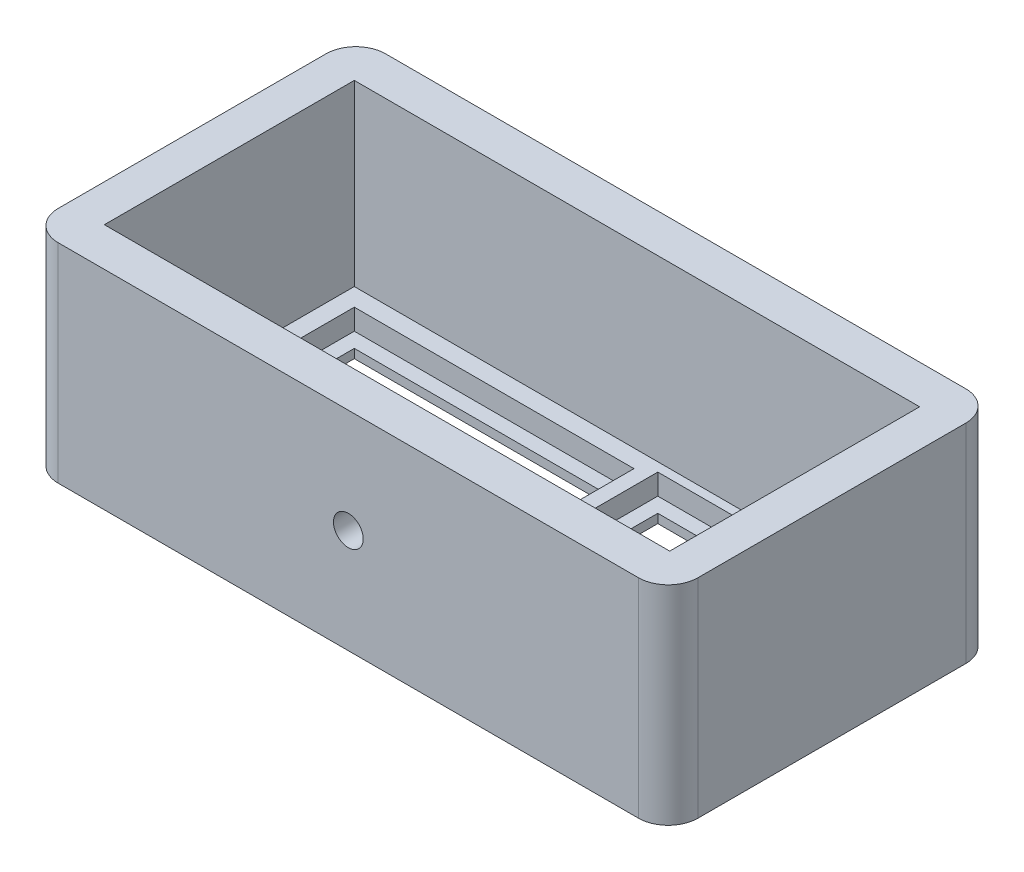
ISO-10303-21;
HEADER;
FILE_DESCRIPTION(('STEP AP214'),'2;1');
FILE_NAME('part.step','',(''),(''),'','','');
FILE_SCHEMA(('AUTOMOTIVE_DESIGN { 1 0 10303 214 1 1 1 1 }'));
ENDSEC;
DATA;
#1=APPLICATION_CONTEXT('core data for automotive mechanical design processes');
#2=APPLICATION_PROTOCOL_DEFINITION('international standard','automotive_design',2000,#1);
#3=PRODUCT_CONTEXT('',#1,'mechanical');
#4=PRODUCT('Part','Part','',(#3));
#5=PRODUCT_RELATED_PRODUCT_CATEGORY('part','',(#4));
#6=PRODUCT_DEFINITION_FORMATION('','',#4);
#7=PRODUCT_DEFINITION_CONTEXT('part definition',#1,'design');
#8=PRODUCT_DEFINITION('design','',#6,#7);
#9=PRODUCT_DEFINITION_SHAPE('','',#8);
#10=(LENGTH_UNIT() NAMED_UNIT(*) SI_UNIT(.MILLI.,.METRE.));
#11=(NAMED_UNIT(*) PLANE_ANGLE_UNIT() SI_UNIT($,.RADIAN.));
#12=(NAMED_UNIT(*) SI_UNIT($,.STERADIAN.) SOLID_ANGLE_UNIT());
#13=UNCERTAINTY_MEASURE_WITH_UNIT(LENGTH_MEASURE(1.E-05),#10,'distance_accuracy_value','');
#14=(GEOMETRIC_REPRESENTATION_CONTEXT(3) GLOBAL_UNCERTAINTY_ASSIGNED_CONTEXT((#13)) GLOBAL_UNIT_ASSIGNED_CONTEXT((#10,
#11,#12)) REPRESENTATION_CONTEXT('',''));
#15=CARTESIAN_POINT('',(0.,0.,0.));
#16=DIRECTION('',(0.,0.,1.));
#17=DIRECTION('',(1.,0.,0.));
#18=AXIS2_PLACEMENT_3D('',#15,#16,#17);
#19=CARTESIAN_POINT('',(-17.8,0.6,-7.2));
#20=DIRECTION('',(-1.,0.,0.));
#21=DIRECTION('',(0.,0.,1.));
#22=AXIS2_PLACEMENT_3D('',#19,#20,#21);
#23=PLANE('',#22);
#24=DIRECTION('',(0.,0.,1.));
#25=VECTOR('',#24,1.);
#26=CARTESIAN_POINT('',(-17.8,2.,-7.2));
#27=LINE('',#26,#25);
#28=CARTESIAN_POINT('',(-17.8,2.,-7.2));
#29=VERTEX_POINT('',#28);
#30=CARTESIAN_POINT('',(-17.8,2.,8.));
#31=VERTEX_POINT('',#30);
#32=EDGE_CURVE('E378',#29,#31,#27,.T.);
#33=ORIENTED_EDGE('',*,*,#32,.T.);
#34=DIRECTION('',(0.,1.,0.));
#35=VECTOR('',#34,1.);
#36=CARTESIAN_POINT('',(-17.8,0.6,8.));
#37=LINE('',#36,#35);
#38=CARTESIAN_POINT('',(-17.8,0.6,8.));
#39=VERTEX_POINT('',#38);
#40=EDGE_CURVE('E377',#39,#31,#37,.T.);
#41=ORIENTED_EDGE('',*,*,#40,.F.);
#42=DIRECTION('',(0.,0.,1.));
#43=VECTOR('',#42,1.);
#44=CARTESIAN_POINT('',(-17.8,0.6,-7.2));
#45=LINE('',#44,#43);
#46=CARTESIAN_POINT('',(-17.8,0.6,-7.2));
#47=VERTEX_POINT('',#46);
#48=EDGE_CURVE('E364',#47,#39,#45,.T.);
#49=ORIENTED_EDGE('',*,*,#48,.F.);
#50=DIRECTION('',(0.,1.,0.));
#51=VECTOR('',#50,1.);
#52=CARTESIAN_POINT('',(-17.8,0.6,-7.2));
#53=LINE('',#52,#51);
#54=EDGE_CURVE('E386',#47,#29,#53,.T.);
#55=ORIENTED_EDGE('',*,*,#54,.T.);
#56=EDGE_LOOP('',(#33,#41,#49,#55));
#57=FACE_BOUND('',#56,.T.);
#58=ADVANCED_FACE('F47',(#57),#23,.F.);
#59=CARTESIAN_POINT('',(-17.8,0.6,8.));
#60=DIRECTION('',(0.,0.,1.));
#61=DIRECTION('',(1.,0.,0.));
#62=AXIS2_PLACEMENT_3D('',#59,#60,#61);
#63=PLANE('',#62);
#64=DIRECTION('',(-1.,0.,0.));
#65=VECTOR('',#64,1.);
#66=CARTESIAN_POINT('',(-17.8,2.,8.));
#67=LINE('',#66,#65);
#68=CARTESIAN_POINT('',(17.8,2.,7.99999999999999));
#69=VERTEX_POINT('',#68);
#70=CARTESIAN_POINT('',(2.00000000000001,2.,8.));
#71=VERTEX_POINT('',#70);
#72=EDGE_CURVE('E253',#69,#71,#67,.T.);
#73=ORIENTED_EDGE('',*,*,#72,.F.);
#74=DIRECTION('',(0.,1.,0.));
#75=VECTOR('',#74,1.);
#76=CARTESIAN_POINT('',(17.8,0.6,8.));
#77=LINE('',#76,#75);
#78=CARTESIAN_POINT('',(17.8,0.6,8.));
#79=VERTEX_POINT('',#78);
#80=EDGE_CURVE('E400',#79,#69,#77,.T.);
#81=ORIENTED_EDGE('',*,*,#80,.F.);
#82=DIRECTION('',(1.,0.,0.));
#83=VECTOR('',#82,1.);
#84=CARTESIAN_POINT('',(2.00000000000001,0.6,8.));
#85=LINE('',#84,#83);
#86=CARTESIAN_POINT('',(2.00000000000001,0.6,8.));
#87=VERTEX_POINT('',#86);
#88=EDGE_CURVE('E420',#87,#79,#85,.T.);
#89=ORIENTED_EDGE('',*,*,#88,.F.);
#90=DIRECTION('',(0.,1.,0.));
#91=VECTOR('',#90,1.);
#92=CARTESIAN_POINT('',(2.00000000000001,0.6,8.));
#93=LINE('',#92,#91);
#94=EDGE_CURVE('E396',#87,#71,#93,.T.);
#95=ORIENTED_EDGE('',*,*,#94,.T.);
#96=EDGE_LOOP('',(#73,#81,#89,#95));
#97=FACE_BOUND('',#96,.T.);
#98=ADVANCED_FACE('F500',(#97),#63,.F.);
#99=CARTESIAN_POINT('',(1.00000000000001,2.,8.));
#100=VERTEX_POINT('',#99);
#101=EDGE_CURVE('E276',#100,#31,#67,.T.);
#102=ORIENTED_EDGE('',*,*,#101,.F.);
#103=DIRECTION('',(0.,1.,0.));
#104=VECTOR('',#103,1.);
#105=CARTESIAN_POINT('',(1.00000000000001,0.6,8.));
#106=LINE('',#105,#104);
#107=CARTESIAN_POINT('',(1.00000000000001,0.6,8.));
#108=VERTEX_POINT('',#107);
#109=EDGE_CURVE('E391',#108,#100,#106,.T.);
#110=ORIENTED_EDGE('',*,*,#109,.F.);
#111=DIRECTION('',(1.,0.,0.));
#112=VECTOR('',#111,1.);
#113=CARTESIAN_POINT('',(-17.8,0.6,8.));
#114=LINE('',#113,#112);
#115=EDGE_CURVE('E367',#39,#108,#114,.T.);
#116=ORIENTED_EDGE('',*,*,#115,.F.);
#117=ORIENTED_EDGE('',*,*,#40,.T.);
#118=EDGE_LOOP('',(#102,#110,#116,#117));
#119=FACE_BOUND('',#118,.T.);
#120=ADVANCED_FACE('F507',(#119),#63,.F.);
#121=CARTESIAN_POINT('',(0.,14.,0.));
#122=DIRECTION('',(0.,1.,0.));
#123=DIRECTION('',(0.,0.,1.));
#124=AXIS2_PLACEMENT_3D('',#121,#122,#123);
#125=PLANE('',#124);
#126=DIRECTION('',(0.,0.,-1.));
#127=VECTOR('',#126,1.);
#128=CARTESIAN_POINT('',(21.5,14.,0.));
#129=LINE('',#128,#127);
#130=CARTESIAN_POINT('',(21.5,14.,8.99999999999999));
#131=VERTEX_POINT('',#130);
#132=CARTESIAN_POINT('',(21.5,14.,-9.00000000000001));
#133=VERTEX_POINT('',#132);
#134=EDGE_CURVE('E277',#131,#133,#129,.T.);
#135=ORIENTED_EDGE('',*,*,#134,.T.);
#136=CARTESIAN_POINT('',(19.5,14.,-9.00000000000001));
#137=DIRECTION('',(0.,1.,0.));
#138=DIRECTION('',(0.,0.,1.));
#139=AXIS2_PLACEMENT_3D('',#136,#137,#138);
#140=CIRCLE('',#139,2.);
#141=CARTESIAN_POINT('',(19.5,14.,-11.));
#142=VERTEX_POINT('',#141);
#143=EDGE_CURVE('E280',#133,#142,#140,.T.);
#144=ORIENTED_EDGE('',*,*,#143,.T.);
#145=DIRECTION('',(-1.,0.,0.));
#146=VECTOR('',#145,1.);
#147=CARTESIAN_POINT('',(0.,14.,-11.));
#148=LINE('',#147,#146);
#149=CARTESIAN_POINT('',(-19.5,14.,-11.));
#150=VERTEX_POINT('',#149);
#151=EDGE_CURVE('E283',#142,#150,#148,.T.);
#152=ORIENTED_EDGE('',*,*,#151,.T.);
#153=CARTESIAN_POINT('',(-19.5,14.,-9.));
#154=DIRECTION('',(0.,1.,0.));
#155=DIRECTION('',(0.,0.,1.));
#156=AXIS2_PLACEMENT_3D('',#153,#154,#155);
#157=CIRCLE('',#156,2.);
#158=CARTESIAN_POINT('',(-21.5,14.,-9.));
#159=VERTEX_POINT('',#158);
#160=EDGE_CURVE('E286',#150,#159,#157,.T.);
#161=ORIENTED_EDGE('',*,*,#160,.T.);
#162=DIRECTION('',(0.,0.,1.));
#163=VECTOR('',#162,1.);
#164=CARTESIAN_POINT('',(-21.5,14.,0.));
#165=LINE('',#164,#163);
#166=CARTESIAN_POINT('',(-21.5,14.,9.));
#167=VERTEX_POINT('',#166);
#168=EDGE_CURVE('E289',#159,#167,#165,.T.);
#169=ORIENTED_EDGE('',*,*,#168,.T.);
#170=CARTESIAN_POINT('',(-19.5,14.,9.));
#171=DIRECTION('',(0.,1.,0.));
#172=DIRECTION('',(0.,0.,1.));
#173=AXIS2_PLACEMENT_3D('',#170,#171,#172);
#174=CIRCLE('',#173,2.);
#175=CARTESIAN_POINT('',(-19.5,14.,11.));
#176=VERTEX_POINT('',#175);
#177=EDGE_CURVE('E292',#167,#176,#174,.T.);
#178=ORIENTED_EDGE('',*,*,#177,.T.);
#179=DIRECTION('',(1.,0.,0.));
#180=VECTOR('',#179,1.);
#181=CARTESIAN_POINT('',(0.,14.,11.));
#182=LINE('',#181,#180);
#183=CARTESIAN_POINT('',(19.5,14.,11.));
#184=VERTEX_POINT('',#183);
#185=EDGE_CURVE('E295',#176,#184,#182,.T.);
#186=ORIENTED_EDGE('',*,*,#185,.T.);
#187=CARTESIAN_POINT('',(19.5,14.,8.99999999999999));
#188=DIRECTION('',(0.,1.,0.));
#189=DIRECTION('',(0.,0.,1.));
#190=AXIS2_PLACEMENT_3D('',#187,#188,#189);
#191=CIRCLE('',#190,2.);
#192=EDGE_CURVE('E298',#184,#131,#191,.T.);
#193=ORIENTED_EDGE('',*,*,#192,.T.);
#194=EDGE_LOOP('',(#135,#144,#152,#161,#169,#178,#186,#193));
#195=FACE_BOUND('',#194,.T.);
#196=DIRECTION('',(1.,0.,0.));
#197=VECTOR('',#196,1.);
#198=CARTESIAN_POINT('',(19.,14.,8.4));
#199=LINE('',#198,#197);
#200=CARTESIAN_POINT('',(-19.,14.,8.4));
#201=VERTEX_POINT('',#200);
#202=CARTESIAN_POINT('',(19.,14.,8.4));
#203=VERTEX_POINT('',#202);
#204=EDGE_CURVE('E245',#201,#203,#199,.T.);
#205=ORIENTED_EDGE('',*,*,#204,.F.);
#206=DIRECTION('',(0.,0.,1.));
#207=VECTOR('',#206,1.);
#208=CARTESIAN_POINT('',(-19.,14.,8.4));
#209=LINE('',#208,#207);
#210=CARTESIAN_POINT('',(-19.,14.,-8.4));
#211=VERTEX_POINT('',#210);
#212=EDGE_CURVE('E234',#211,#201,#209,.T.);
#213=ORIENTED_EDGE('',*,*,#212,.F.);
#214=DIRECTION('',(-1.,0.,0.));
#215=VECTOR('',#214,1.);
#216=CARTESIAN_POINT('',(19.,14.,-8.4));
#217=LINE('',#216,#215);
#218=CARTESIAN_POINT('',(19.,14.,-8.4));
#219=VERTEX_POINT('',#218);
#220=EDGE_CURVE('E260',#219,#211,#217,.T.);
#221=ORIENTED_EDGE('',*,*,#220,.F.);
#222=DIRECTION('',(0.,0.,-1.));
#223=VECTOR('',#222,1.);
#224=CARTESIAN_POINT('',(19.,14.,8.4));
#225=LINE('',#224,#223);
#226=EDGE_CURVE('E258',#203,#219,#225,.T.);
#227=ORIENTED_EDGE('',*,*,#226,.F.);
#228=EDGE_LOOP('',(#205,#213,#221,#227));
#229=FACE_BOUND('',#228,.T.);
#230=ADVANCED_FACE('F257',(#195,#229),#125,.T.);
#231=CARTESIAN_POINT('',(19.5,2.,-9.00000000000001));
#232=DIRECTION('',(0.,-1.,0.));
#233=DIRECTION('',(0.,0.,-1.));
#234=AXIS2_PLACEMENT_3D('',#231,#232,#233);
#235=PLANE('',#234);
#236=DIRECTION('',(0.,0.,-1.));
#237=VECTOR('',#236,1.);
#238=CARTESIAN_POINT('',(1.,2.,-7.2));
#239=LINE('',#238,#237);
#240=CARTESIAN_POINT('',(1.,2.,-7.2));
#241=VERTEX_POINT('',#240);
#242=EDGE_CURVE('E380',#100,#241,#239,.T.);
#243=ORIENTED_EDGE('',*,*,#242,.F.);
#244=ORIENTED_EDGE('',*,*,#101,.T.);
#245=ORIENTED_EDGE('',*,*,#32,.F.);
#246=DIRECTION('',(-1.,0.,0.));
#247=VECTOR('',#246,1.);
#248=CARTESIAN_POINT('',(-17.8,2.,-7.2));
#249=LINE('',#248,#247);
#250=EDGE_CURVE('E368',#241,#29,#249,.T.);
#251=ORIENTED_EDGE('',*,*,#250,.F.);
#252=EDGE_LOOP('',(#243,#244,#245,#251));
#253=FACE_BOUND('',#252,.T.);
#254=ORIENTED_EDGE('',*,*,#72,.T.);
#255=DIRECTION('',(0.,0.,1.));
#256=VECTOR('',#255,1.);
#257=CARTESIAN_POINT('',(2.,2.,-7.8));
#258=LINE('',#257,#256);
#259=CARTESIAN_POINT('',(2.,2.,-7.8));
#260=VERTEX_POINT('',#259);
#261=EDGE_CURVE('E381',#260,#71,#258,.T.);
#262=ORIENTED_EDGE('',*,*,#261,.F.);
#263=DIRECTION('',(-1.,0.,0.));
#264=VECTOR('',#263,1.);
#265=CARTESIAN_POINT('',(2.,2.,-7.8));
#266=LINE('',#265,#264);
#267=CARTESIAN_POINT('',(17.8,2.,-7.8));
#268=VERTEX_POINT('',#267);
#269=EDGE_CURVE('E407',#268,#260,#266,.T.);
#270=ORIENTED_EDGE('',*,*,#269,.F.);
#271=DIRECTION('',(0.,0.,-1.));
#272=VECTOR('',#271,1.);
#273=CARTESIAN_POINT('',(17.8,2.,-7.8));
#274=LINE('',#273,#272);
#275=EDGE_CURVE('E410',#69,#268,#274,.T.);
#276=ORIENTED_EDGE('',*,*,#275,.F.);
#277=EDGE_LOOP('',(#254,#262,#270,#276));
#278=FACE_BOUND('',#277,.T.);
#279=DIRECTION('',(0.,0.,1.));
#280=VECTOR('',#279,1.);
#281=CARTESIAN_POINT('',(-19.,2.,8.4));
#282=LINE('',#281,#280);
#283=CARTESIAN_POINT('',(-19.,2.,-8.4));
#284=VERTEX_POINT('',#283);
#285=CARTESIAN_POINT('',(-19.,2.,8.4));
#286=VERTEX_POINT('',#285);
#287=EDGE_CURVE('E265',#284,#286,#282,.T.);
#288=ORIENTED_EDGE('',*,*,#287,.T.);
#289=DIRECTION('',(1.,0.,0.));
#290=VECTOR('',#289,1.);
#291=CARTESIAN_POINT('',(19.,2.,8.4));
#292=LINE('',#291,#290);
#293=CARTESIAN_POINT('',(19.,2.,8.4));
#294=VERTEX_POINT('',#293);
#295=EDGE_CURVE('E252',#286,#294,#292,.T.);
#296=ORIENTED_EDGE('',*,*,#295,.T.);
#297=DIRECTION('',(0.,0.,-1.));
#298=VECTOR('',#297,1.);
#299=CARTESIAN_POINT('',(19.,2.,8.4));
#300=LINE('',#299,#298);
#301=CARTESIAN_POINT('',(19.,2.,-8.4));
#302=VERTEX_POINT('',#301);
#303=EDGE_CURVE('E269',#294,#302,#300,.T.);
#304=ORIENTED_EDGE('',*,*,#303,.T.);
#305=DIRECTION('',(-1.,0.,0.));
#306=VECTOR('',#305,1.);
#307=CARTESIAN_POINT('',(19.,2.,-8.4));
#308=LINE('',#307,#306);
#309=EDGE_CURVE('E246',#302,#284,#308,.T.);
#310=ORIENTED_EDGE('',*,*,#309,.T.);
#311=EDGE_LOOP('',(#288,#296,#304,#310));
#312=FACE_BOUND('',#311,.T.);
#313=ADVANCED_FACE('F498',(#253,#278,#312),#235,.F.);
#314=CARTESIAN_POINT('',(19.5,2.,-9.00000000000001));
#315=DIRECTION('',(0.,-1.,0.));
#316=DIRECTION('',(0.,0.,-1.));
#317=AXIS2_PLACEMENT_3D('',#314,#315,#316);
#318=CYLINDRICAL_SURFACE('',#317,2.);
#319=CARTESIAN_POINT('',(19.5,0.,-9.00000000000001));
#320=DIRECTION('',(0.,1.,0.));
#321=DIRECTION('',(0.,0.,-1.));
#322=AXIS2_PLACEMENT_3D('',#319,#320,#321);
#323=CIRCLE('',#322,2.);
#324=CARTESIAN_POINT('',(21.5,0.,-9.00000000000001));
#325=VERTEX_POINT('',#324);
#326=CARTESIAN_POINT('',(19.5,0.,-11.));
#327=VERTEX_POINT('',#326);
#328=EDGE_CURVE('E388',#325,#327,#323,.T.);
#329=ORIENTED_EDGE('',*,*,#328,.T.);
#330=DIRECTION('',(0.,-1.,0.));
#331=VECTOR('',#330,1.);
#332=CARTESIAN_POINT('',(19.5,2.,-11.));
#333=LINE('',#332,#331);
#334=EDGE_CURVE('E11',#142,#327,#333,.T.);
#335=ORIENTED_EDGE('',*,*,#334,.F.);
#336=ORIENTED_EDGE('',*,*,#143,.F.);
#337=DIRECTION('',(0.,-1.,0.));
#338=VECTOR('',#337,1.);
#339=CARTESIAN_POINT('',(21.5,2.,-9.00000000000001));
#340=LINE('',#339,#338);
#341=EDGE_CURVE('E441',#133,#325,#340,.T.);
#342=ORIENTED_EDGE('',*,*,#341,.T.);
#343=EDGE_LOOP('',(#329,#335,#336,#342));
#344=FACE_BOUND('',#343,.T.);
#345=ADVANCED_FACE('F49',(#344),#318,.T.);
#346=CARTESIAN_POINT('',(19.5,2.,-11.));
#347=DIRECTION('',(0.,0.,1.));
#348=DIRECTION('',(1.,0.,0.));
#349=AXIS2_PLACEMENT_3D('',#346,#347,#348);
#350=PLANE('',#349);
#351=DIRECTION('',(-1.,0.,0.));
#352=VECTOR('',#351,1.);
#353=CARTESIAN_POINT('',(19.5,0.,-11.));
#354=LINE('',#353,#352);
#355=CARTESIAN_POINT('',(-19.5,0.,-11.));
#356=VERTEX_POINT('',#355);
#357=EDGE_CURVE('E427',#327,#356,#354,.T.);
#358=ORIENTED_EDGE('',*,*,#357,.T.);
#359=DIRECTION('',(0.,-1.,0.));
#360=VECTOR('',#359,1.);
#361=CARTESIAN_POINT('',(-19.5,2.,-11.));
#362=LINE('',#361,#360);
#363=EDGE_CURVE('E55',#150,#356,#362,.T.);
#364=ORIENTED_EDGE('',*,*,#363,.F.);
#365=ORIENTED_EDGE('',*,*,#151,.F.);
#366=ORIENTED_EDGE('',*,*,#334,.T.);
#367=EDGE_LOOP('',(#358,#364,#365,#366));
#368=FACE_BOUND('',#367,.T.);
#369=ADVANCED_FACE('F491',(#368),#350,.F.);
#370=CARTESIAN_POINT('',(-19.5,2.,-9.));
#371=DIRECTION('',(0.,-1.,0.));
#372=DIRECTION('',(0.,0.,-1.));
#373=AXIS2_PLACEMENT_3D('',#370,#371,#372);
#374=CYLINDRICAL_SURFACE('',#373,2.);
#375=CARTESIAN_POINT('',(-19.5,0.,-9.));
#376=DIRECTION('',(0.,1.,0.));
#377=DIRECTION('',(0.,0.,-1.));
#378=AXIS2_PLACEMENT_3D('',#375,#376,#377);
#379=CIRCLE('',#378,2.);
#380=CARTESIAN_POINT('',(-21.5,0.,-9.));
#381=VERTEX_POINT('',#380);
#382=EDGE_CURVE('E429',#356,#381,#379,.T.);
#383=ORIENTED_EDGE('',*,*,#382,.T.);
#384=DIRECTION('',(0.,-1.,0.));
#385=VECTOR('',#384,1.);
#386=CARTESIAN_POINT('',(-21.5,2.,-9.));
#387=LINE('',#386,#385);
#388=EDGE_CURVE('E456',#159,#381,#387,.T.);
#389=ORIENTED_EDGE('',*,*,#388,.F.);
#390=ORIENTED_EDGE('',*,*,#160,.F.);
#391=ORIENTED_EDGE('',*,*,#363,.T.);
#392=EDGE_LOOP('',(#383,#389,#390,#391));
#393=FACE_BOUND('',#392,.T.);
#394=ADVANCED_FACE('F462',(#393),#374,.T.);
#395=CARTESIAN_POINT('',(-21.5,2.,9.));
#396=DIRECTION('',(1.,0.,0.));
#397=DIRECTION('',(0.,0.,-1.));
#398=AXIS2_PLACEMENT_3D('',#395,#396,#397);
#399=PLANE('',#398);
#400=DIRECTION('',(0.,0.,1.));
#401=VECTOR('',#400,1.);
#402=CARTESIAN_POINT('',(-21.5,0.,9.));
#403=LINE('',#402,#401);
#404=CARTESIAN_POINT('',(-21.5,0.,9.));
#405=VERTEX_POINT('',#404);
#406=EDGE_CURVE('E431',#381,#405,#403,.T.);
#407=ORIENTED_EDGE('',*,*,#406,.T.);
#408=DIRECTION('',(0.,-1.,0.));
#409=VECTOR('',#408,1.);
#410=CARTESIAN_POINT('',(-21.5,2.,9.));
#411=LINE('',#410,#409);
#412=EDGE_CURVE('E453',#167,#405,#411,.T.);
#413=ORIENTED_EDGE('',*,*,#412,.F.);
#414=ORIENTED_EDGE('',*,*,#168,.F.);
#415=ORIENTED_EDGE('',*,*,#388,.T.);
#416=EDGE_LOOP('',(#407,#413,#414,#415));
#417=FACE_BOUND('',#416,.T.);
#418=ADVANCED_FACE('F472',(#417),#399,.F.);
#419=CARTESIAN_POINT('',(-19.5,2.,9.));
#420=DIRECTION('',(0.,-1.,0.));
#421=DIRECTION('',(0.,0.,-1.));
#422=AXIS2_PLACEMENT_3D('',#419,#420,#421);
#423=CYLINDRICAL_SURFACE('',#422,2.);
#424=CARTESIAN_POINT('',(-19.5,0.,9.));
#425=DIRECTION('',(0.,1.,0.));
#426=DIRECTION('',(0.,0.,-1.));
#427=AXIS2_PLACEMENT_3D('',#424,#425,#426);
#428=CIRCLE('',#427,2.);
#429=CARTESIAN_POINT('',(-19.5,0.,11.));
#430=VERTEX_POINT('',#429);
#431=EDGE_CURVE('E433',#405,#430,#428,.T.);
#432=ORIENTED_EDGE('',*,*,#431,.T.);
#433=DIRECTION('',(0.,-1.,0.));
#434=VECTOR('',#433,1.);
#435=CARTESIAN_POINT('',(-19.5,2.,11.));
#436=LINE('',#435,#434);
#437=EDGE_CURVE('E450',#176,#430,#436,.T.);
#438=ORIENTED_EDGE('',*,*,#437,.F.);
#439=ORIENTED_EDGE('',*,*,#177,.F.);
#440=ORIENTED_EDGE('',*,*,#412,.T.);
#441=EDGE_LOOP('',(#432,#438,#439,#440));
#442=FACE_BOUND('',#441,.T.);
#443=ADVANCED_FACE('F476',(#442),#423,.T.);
#444=CARTESIAN_POINT('',(19.5,2.,11.));
#445=DIRECTION('',(0.,0.,-1.));
#446=DIRECTION('',(-1.,0.,0.));
#447=AXIS2_PLACEMENT_3D('',#444,#445,#446);
#448=PLANE('',#447);
#449=CARTESIAN_POINT('',(0.,7.,11.));
#450=DIRECTION('',(0.,0.,1.));
#451=DIRECTION('',(1.,0.,0.));
#452=AXIS2_PLACEMENT_3D('',#449,#450,#451);
#453=CIRCLE('',#452,1.);
#454=CARTESIAN_POINT('',(1.,7.,11.));
#455=VERTEX_POINT('',#454);
#456=EDGE_CURVE('E267',#455,#455,#453,.T.);
#457=ORIENTED_EDGE('',*,*,#456,.F.);
#458=EDGE_LOOP('',(#457));
#459=FACE_BOUND('',#458,.T.);
#460=DIRECTION('',(1.,0.,0.));
#461=VECTOR('',#460,1.);
#462=CARTESIAN_POINT('',(19.5,0.,11.));
#463=LINE('',#462,#461);
#464=CARTESIAN_POINT('',(19.5,0.,11.));
#465=VERTEX_POINT('',#464);
#466=EDGE_CURVE('E435',#430,#465,#463,.T.);
#467=ORIENTED_EDGE('',*,*,#466,.T.);
#468=DIRECTION('',(0.,-1.,0.));
#469=VECTOR('',#468,1.);
#470=CARTESIAN_POINT('',(19.5,2.,11.));
#471=LINE('',#470,#469);
#472=EDGE_CURVE('E447',#184,#465,#471,.T.);
#473=ORIENTED_EDGE('',*,*,#472,.F.);
#474=ORIENTED_EDGE('',*,*,#185,.F.);
#475=ORIENTED_EDGE('',*,*,#437,.T.);
#476=EDGE_LOOP('',(#467,#473,#474,#475));
#477=FACE_BOUND('',#476,.T.);
#478=ADVANCED_FACE('F481',(#459,#477),#448,.F.);
#479=CARTESIAN_POINT('',(19.5,2.,8.99999999999999));
#480=DIRECTION('',(0.,-1.,0.));
#481=DIRECTION('',(0.,0.,-1.));
#482=AXIS2_PLACEMENT_3D('',#479,#480,#481);
#483=CYLINDRICAL_SURFACE('',#482,2.);
#484=CARTESIAN_POINT('',(19.5,0.,8.99999999999999));
#485=DIRECTION('',(0.,1.,0.));
#486=DIRECTION('',(0.,0.,-1.));
#487=AXIS2_PLACEMENT_3D('',#484,#485,#486);
#488=CIRCLE('',#487,2.);
#489=CARTESIAN_POINT('',(21.5,0.,8.99999999999999));
#490=VERTEX_POINT('',#489);
#491=EDGE_CURVE('E437',#465,#490,#488,.T.);
#492=ORIENTED_EDGE('',*,*,#491,.T.);
#493=DIRECTION('',(0.,-1.,0.));
#494=VECTOR('',#493,1.);
#495=CARTESIAN_POINT('',(21.5,2.,8.99999999999999));
#496=LINE('',#495,#494);
#497=EDGE_CURVE('E444',#131,#490,#496,.T.);
#498=ORIENTED_EDGE('',*,*,#497,.F.);
#499=ORIENTED_EDGE('',*,*,#192,.F.);
#500=ORIENTED_EDGE('',*,*,#472,.T.);
#501=EDGE_LOOP('',(#492,#498,#499,#500));
#502=FACE_BOUND('',#501,.T.);
#503=ADVANCED_FACE('F484',(#502),#483,.T.);
#504=CARTESIAN_POINT('',(21.5,2.,8.99999999999999));
#505=DIRECTION('',(-1.,0.,0.));
#506=DIRECTION('',(0.,0.,1.));
#507=AXIS2_PLACEMENT_3D('',#504,#505,#506);
#508=PLANE('',#507);
#509=DIRECTION('',(0.,0.,-1.));
#510=VECTOR('',#509,1.);
#511=CARTESIAN_POINT('',(21.5,0.,8.99999999999999));
#512=LINE('',#511,#510);
#513=EDGE_CURVE('E439',#490,#325,#512,.T.);
#514=ORIENTED_EDGE('',*,*,#513,.T.);
#515=ORIENTED_EDGE('',*,*,#341,.F.);
#516=ORIENTED_EDGE('',*,*,#134,.F.);
#517=ORIENTED_EDGE('',*,*,#497,.T.);
#518=EDGE_LOOP('',(#514,#515,#516,#517));
#519=FACE_BOUND('',#518,.T.);
#520=ADVANCED_FACE('F487',(#519),#508,.F.);
#521=CARTESIAN_POINT('',(19.5,0.,-9.00000000000001));
#522=DIRECTION('',(0.,-1.,0.));
#523=DIRECTION('',(0.,0.,-1.));
#524=AXIS2_PLACEMENT_3D('',#521,#522,#523);
#525=PLANE('',#524);
#526=DIRECTION('',(0.,0.,1.));
#527=VECTOR('',#526,1.);
#528=CARTESIAN_POINT('',(-16.8,0.,-6.2));
#529=LINE('',#528,#527);
#530=CARTESIAN_POINT('',(-16.8,0.,-6.2));
#531=VERTEX_POINT('',#530);
#532=CARTESIAN_POINT('',(-16.8,0.,7.));
#533=VERTEX_POINT('',#532);
#534=EDGE_CURVE('E302',#531,#533,#529,.T.);
#535=ORIENTED_EDGE('',*,*,#534,.T.);
#536=DIRECTION('',(1.,0.,0.));
#537=VECTOR('',#536,1.);
#538=CARTESIAN_POINT('',(-16.8,0.,7.));
#539=LINE('',#538,#537);
#540=CARTESIAN_POINT('',(0.,0.,7.));
#541=VERTEX_POINT('',#540);
#542=EDGE_CURVE('E305',#533,#541,#539,.T.);
#543=ORIENTED_EDGE('',*,*,#542,.T.);
#544=DIRECTION('',(0.,0.,-1.));
#545=VECTOR('',#544,1.);
#546=CARTESIAN_POINT('',(0.,0.,-6.2));
#547=LINE('',#546,#545);
#548=CARTESIAN_POINT('',(0.,0.,-6.2));
#549=VERTEX_POINT('',#548);
#550=EDGE_CURVE('E309',#541,#549,#547,.T.);
#551=ORIENTED_EDGE('',*,*,#550,.T.);
#552=DIRECTION('',(-1.,0.,0.));
#553=VECTOR('',#552,1.);
#554=CARTESIAN_POINT('',(-16.8,0.,-6.2));
#555=LINE('',#554,#553);
#556=EDGE_CURVE('E312',#549,#531,#555,.T.);
#557=ORIENTED_EDGE('',*,*,#556,.T.);
#558=EDGE_LOOP('',(#535,#543,#551,#557));
#559=FACE_BOUND('',#558,.T.);
#560=DIRECTION('',(0.,0.,1.));
#561=VECTOR('',#560,1.);
#562=CARTESIAN_POINT('',(3.,0.,-6.8));
#563=LINE('',#562,#561);
#564=CARTESIAN_POINT('',(3.,0.,-6.8));
#565=VERTEX_POINT('',#564);
#566=CARTESIAN_POINT('',(3.00000000000001,0.,7.));
#567=VERTEX_POINT('',#566);
#568=EDGE_CURVE('E347',#565,#567,#563,.T.);
#569=ORIENTED_EDGE('',*,*,#568,.T.);
#570=DIRECTION('',(1.,0.,0.));
#571=VECTOR('',#570,1.);
#572=CARTESIAN_POINT('',(3.00000000000001,0.,7.));
#573=LINE('',#572,#571);
#574=CARTESIAN_POINT('',(16.8,0.,7.));
#575=VERTEX_POINT('',#574);
#576=EDGE_CURVE('E359',#567,#575,#573,.T.);
#577=ORIENTED_EDGE('',*,*,#576,.T.);
#578=DIRECTION('',(0.,0.,-1.));
#579=VECTOR('',#578,1.);
#580=CARTESIAN_POINT('',(16.8,0.,-6.8));
#581=LINE('',#580,#579);
#582=CARTESIAN_POINT('',(16.8,0.,-6.8));
#583=VERTEX_POINT('',#582);
#584=EDGE_CURVE('E356',#575,#583,#581,.T.);
#585=ORIENTED_EDGE('',*,*,#584,.T.);
#586=DIRECTION('',(-1.,0.,0.));
#587=VECTOR('',#586,1.);
#588=CARTESIAN_POINT('',(3.,0.,-6.8));
#589=LINE('',#588,#587);
#590=EDGE_CURVE('E338',#583,#565,#589,.T.);
#591=ORIENTED_EDGE('',*,*,#590,.T.);
#592=EDGE_LOOP('',(#569,#577,#585,#591));
#593=FACE_BOUND('',#592,.T.);
#594=ORIENTED_EDGE('',*,*,#328,.F.);
#595=ORIENTED_EDGE('',*,*,#513,.F.);
#596=ORIENTED_EDGE('',*,*,#491,.F.);
#597=ORIENTED_EDGE('',*,*,#466,.F.);
#598=ORIENTED_EDGE('',*,*,#431,.F.);
#599=ORIENTED_EDGE('',*,*,#406,.F.);
#600=ORIENTED_EDGE('',*,*,#382,.F.);
#601=ORIENTED_EDGE('',*,*,#357,.F.);
#602=EDGE_LOOP('',(#594,#595,#596,#597,#598,#599,#600,#601));
#603=FACE_BOUND('',#602,.T.);
#604=ADVANCED_FACE('F468',(#559,#593,#603),#525,.T.);
#605=CARTESIAN_POINT('',(2.,0.6,-7.8));
#606=DIRECTION('',(-1.,0.,0.));
#607=DIRECTION('',(0.,0.,1.));
#608=AXIS2_PLACEMENT_3D('',#605,#606,#607);
#609=PLANE('',#608);
#610=ORIENTED_EDGE('',*,*,#261,.T.);
#611=ORIENTED_EDGE('',*,*,#94,.F.);
#612=DIRECTION('',(0.,0.,1.));
#613=VECTOR('',#612,1.);
#614=CARTESIAN_POINT('',(2.,0.6,-7.8));
#615=LINE('',#614,#613);
#616=CARTESIAN_POINT('',(2.,0.6,-7.8));
#617=VERTEX_POINT('',#616);
#618=EDGE_CURVE('E411',#617,#87,#615,.T.);
#619=ORIENTED_EDGE('',*,*,#618,.F.);
#620=DIRECTION('',(0.,1.,0.));
#621=VECTOR('',#620,1.);
#622=CARTESIAN_POINT('',(2.,0.6,-7.8));
#623=LINE('',#622,#621);
#624=EDGE_CURVE('E329',#617,#260,#623,.T.);
#625=ORIENTED_EDGE('',*,*,#624,.T.);
#626=EDGE_LOOP('',(#610,#611,#619,#625));
#627=FACE_BOUND('',#626,.T.);
#628=ADVANCED_FACE('F512',(#627),#609,.F.);
#629=CARTESIAN_POINT('',(2.,0.6,-7.8));
#630=DIRECTION('',(0.,0.,-1.));
#631=DIRECTION('',(-1.,0.,0.));
#632=AXIS2_PLACEMENT_3D('',#629,#630,#631);
#633=PLANE('',#632);
#634=ORIENTED_EDGE('',*,*,#269,.T.);
#635=ORIENTED_EDGE('',*,*,#624,.F.);
#636=DIRECTION('',(-1.,0.,0.));
#637=VECTOR('',#636,1.);
#638=CARTESIAN_POINT('',(2.,0.6,-7.8));
#639=LINE('',#638,#637);
#640=CARTESIAN_POINT('',(17.8,0.6,-7.8));
#641=VERTEX_POINT('',#640);
#642=EDGE_CURVE('E399',#641,#617,#639,.T.);
#643=ORIENTED_EDGE('',*,*,#642,.F.);
#644=DIRECTION('',(0.,1.,0.));
#645=VECTOR('',#644,1.);
#646=CARTESIAN_POINT('',(17.8,0.6,-7.8));
#647=LINE('',#646,#645);
#648=EDGE_CURVE('E403',#641,#268,#647,.T.);
#649=ORIENTED_EDGE('',*,*,#648,.T.);
#650=EDGE_LOOP('',(#634,#635,#643,#649));
#651=FACE_BOUND('',#650,.T.);
#652=ADVANCED_FACE('F515',(#651),#633,.F.);
#653=CARTESIAN_POINT('',(17.8,0.6,-7.8));
#654=DIRECTION('',(1.,0.,0.));
#655=DIRECTION('',(0.,0.,-1.));
#656=AXIS2_PLACEMENT_3D('',#653,#654,#655);
#657=PLANE('',#656);
#658=ORIENTED_EDGE('',*,*,#80,.T.);
#659=ORIENTED_EDGE('',*,*,#275,.T.);
#660=ORIENTED_EDGE('',*,*,#648,.F.);
#661=DIRECTION('',(0.,0.,-1.));
#662=VECTOR('',#661,1.);
#663=CARTESIAN_POINT('',(17.8,0.6,-7.8));
#664=LINE('',#663,#662);
#665=EDGE_CURVE('E417',#79,#641,#664,.T.);
#666=ORIENTED_EDGE('',*,*,#665,.F.);
#667=EDGE_LOOP('',(#658,#659,#660,#666));
#668=FACE_BOUND('',#667,.T.);
#669=ADVANCED_FACE('F517',(#668),#657,.F.);
#670=CARTESIAN_POINT('',(0.,0.6,0.));
#671=DIRECTION('',(0.,1.,0.));
#672=DIRECTION('',(0.,0.,1.));
#673=AXIS2_PLACEMENT_3D('',#670,#671,#672);
#674=PLANE('',#673);
#675=DIRECTION('',(0.,0.,1.));
#676=VECTOR('',#675,1.);
#677=CARTESIAN_POINT('',(3.,0.6,-6.8));
#678=LINE('',#677,#676);
#679=CARTESIAN_POINT('',(3.,0.6,-6.8));
#680=VERTEX_POINT('',#679);
#681=CARTESIAN_POINT('',(3.00000000000001,0.6,7.));
#682=VERTEX_POINT('',#681);
#683=EDGE_CURVE('E320',#680,#682,#678,.T.);
#684=ORIENTED_EDGE('',*,*,#683,.F.);
#685=DIRECTION('',(-1.,0.,0.));
#686=VECTOR('',#685,1.);
#687=CARTESIAN_POINT('',(3.,0.6,-6.8));
#688=LINE('',#687,#686);
#689=CARTESIAN_POINT('',(16.8,0.6,-6.8));
#690=VERTEX_POINT('',#689);
#691=EDGE_CURVE('E344',#690,#680,#688,.T.);
#692=ORIENTED_EDGE('',*,*,#691,.F.);
#693=DIRECTION('',(0.,0.,-1.));
#694=VECTOR('',#693,1.);
#695=CARTESIAN_POINT('',(16.8,0.6,-6.8));
#696=LINE('',#695,#694);
#697=CARTESIAN_POINT('',(16.8,0.6,7.));
#698=VERTEX_POINT('',#697);
#699=EDGE_CURVE('E70',#698,#690,#696,.T.);
#700=ORIENTED_EDGE('',*,*,#699,.F.);
#701=DIRECTION('',(1.,0.,0.));
#702=VECTOR('',#701,1.);
#703=CARTESIAN_POINT('',(3.00000000000001,0.6,7.));
#704=LINE('',#703,#702);
#705=EDGE_CURVE('E349',#682,#698,#704,.T.);
#706=ORIENTED_EDGE('',*,*,#705,.F.);
#707=EDGE_LOOP('',(#684,#692,#700,#706));
#708=FACE_BOUND('',#707,.T.);
#709=ORIENTED_EDGE('',*,*,#618,.T.);
#710=ORIENTED_EDGE('',*,*,#88,.T.);
#711=ORIENTED_EDGE('',*,*,#665,.T.);
#712=ORIENTED_EDGE('',*,*,#642,.T.);
#713=EDGE_LOOP('',(#709,#710,#711,#712));
#714=FACE_BOUND('',#713,.T.);
#715=ADVANCED_FACE('F520',(#708,#714),#674,.T.);
#716=CARTESIAN_POINT('',(-17.8,0.6,-7.2));
#717=DIRECTION('',(0.,0.,-1.));
#718=DIRECTION('',(-1.,0.,0.));
#719=AXIS2_PLACEMENT_3D('',#716,#717,#718);
#720=PLANE('',#719);
#721=ORIENTED_EDGE('',*,*,#250,.T.);
#722=ORIENTED_EDGE('',*,*,#54,.F.);
#723=DIRECTION('',(-1.,0.,0.));
#724=VECTOR('',#723,1.);
#725=CARTESIAN_POINT('',(-17.8,0.6,-7.2));
#726=LINE('',#725,#724);
#727=CARTESIAN_POINT('',(1.,0.6,-7.2));
#728=VERTEX_POINT('',#727);
#729=EDGE_CURVE('E374',#728,#47,#726,.T.);
#730=ORIENTED_EDGE('',*,*,#729,.F.);
#731=DIRECTION('',(0.,1.,0.));
#732=VECTOR('',#731,1.);
#733=CARTESIAN_POINT('',(1.,0.6,-7.2));
#734=LINE('',#733,#732);
#735=EDGE_CURVE('E389',#728,#241,#734,.T.);
#736=ORIENTED_EDGE('',*,*,#735,.T.);
#737=EDGE_LOOP('',(#721,#722,#730,#736));
#738=FACE_BOUND('',#737,.T.);
#739=ADVANCED_FACE('F527',(#738),#720,.F.);
#740=CARTESIAN_POINT('',(1.,0.6,-7.2));
#741=DIRECTION('',(1.,0.,0.));
#742=DIRECTION('',(0.,0.,-1.));
#743=AXIS2_PLACEMENT_3D('',#740,#741,#742);
#744=PLANE('',#743);
#745=ORIENTED_EDGE('',*,*,#242,.T.);
#746=ORIENTED_EDGE('',*,*,#735,.F.);
#747=DIRECTION('',(0.,0.,-1.));
#748=VECTOR('',#747,1.);
#749=CARTESIAN_POINT('',(1.,0.6,-7.2));
#750=LINE('',#749,#748);
#751=EDGE_CURVE('E371',#108,#728,#750,.T.);
#752=ORIENTED_EDGE('',*,*,#751,.F.);
#753=ORIENTED_EDGE('',*,*,#109,.T.);
#754=EDGE_LOOP('',(#745,#746,#752,#753));
#755=FACE_BOUND('',#754,.T.);
#756=ADVANCED_FACE('F723',(#755),#744,.F.);
#757=CARTESIAN_POINT('',(0.,0.6,0.));
#758=DIRECTION('',(0.,1.,0.));
#759=DIRECTION('',(0.,0.,1.));
#760=AXIS2_PLACEMENT_3D('',#757,#758,#759);
#761=PLANE('',#760);
#762=DIRECTION('',(0.,0.,1.));
#763=VECTOR('',#762,1.);
#764=CARTESIAN_POINT('',(-16.8,0.6,-6.2));
#765=LINE('',#764,#763);
#766=CARTESIAN_POINT('',(-16.8,0.6,-6.2));
#767=VERTEX_POINT('',#766);
#768=CARTESIAN_POINT('',(-16.8,0.6,7.));
#769=VERTEX_POINT('',#768);
#770=EDGE_CURVE('E316',#767,#769,#765,.T.);
#771=ORIENTED_EDGE('',*,*,#770,.F.);
#772=DIRECTION('',(-1.,0.,0.));
#773=VECTOR('',#772,1.);
#774=CARTESIAN_POINT('',(-16.8,0.6,-6.2));
#775=LINE('',#774,#773);
#776=CARTESIAN_POINT('',(0.,0.6,-6.2));
#777=VERTEX_POINT('',#776);
#778=EDGE_CURVE('E306',#777,#767,#775,.T.);
#779=ORIENTED_EDGE('',*,*,#778,.F.);
#780=DIRECTION('',(0.,0.,-1.));
#781=VECTOR('',#780,1.);
#782=CARTESIAN_POINT('',(0.,0.6,-6.2));
#783=LINE('',#782,#781);
#784=CARTESIAN_POINT('',(0.,0.6,7.));
#785=VERTEX_POINT('',#784);
#786=EDGE_CURVE('E323',#785,#777,#783,.T.);
#787=ORIENTED_EDGE('',*,*,#786,.F.);
#788=DIRECTION('',(1.,0.,0.));
#789=VECTOR('',#788,1.);
#790=CARTESIAN_POINT('',(-16.8,0.6,7.));
#791=LINE('',#790,#789);
#792=EDGE_CURVE('E319',#769,#785,#791,.T.);
#793=ORIENTED_EDGE('',*,*,#792,.F.);
#794=EDGE_LOOP('',(#771,#779,#787,#793));
#795=FACE_BOUND('',#794,.T.);
#796=ORIENTED_EDGE('',*,*,#48,.T.);
#797=ORIENTED_EDGE('',*,*,#115,.T.);
#798=ORIENTED_EDGE('',*,*,#751,.T.);
#799=ORIENTED_EDGE('',*,*,#729,.T.);
#800=EDGE_LOOP('',(#796,#797,#798,#799));
#801=FACE_BOUND('',#800,.T.);
#802=ADVANCED_FACE('F710',(#795,#801),#761,.T.);
#803=CARTESIAN_POINT('',(3.,0.,-6.8));
#804=DIRECTION('',(-1.,0.,0.));
#805=DIRECTION('',(0.,0.,1.));
#806=AXIS2_PLACEMENT_3D('',#803,#804,#805);
#807=PLANE('',#806);
#808=ORIENTED_EDGE('',*,*,#683,.T.);
#809=DIRECTION('',(0.,1.,0.));
#810=VECTOR('',#809,1.);
#811=CARTESIAN_POINT('',(3.00000000000001,0.,7.));
#812=LINE('',#811,#810);
#813=EDGE_CURVE('E336',#567,#682,#812,.T.);
#814=ORIENTED_EDGE('',*,*,#813,.F.);
#815=ORIENTED_EDGE('',*,*,#568,.F.);
#816=DIRECTION('',(0.,1.,0.));
#817=VECTOR('',#816,1.);
#818=CARTESIAN_POINT('',(3.,0.,-6.8));
#819=LINE('',#818,#817);
#820=EDGE_CURVE('E301',#565,#680,#819,.T.);
#821=ORIENTED_EDGE('',*,*,#820,.T.);
#822=EDGE_LOOP('',(#808,#814,#815,#821));
#823=FACE_BOUND('',#822,.T.);
#824=ADVANCED_FACE('F706',(#823),#807,.F.);
#825=CARTESIAN_POINT('',(3.,0.,-6.8));
#826=DIRECTION('',(0.,0.,-1.));
#827=DIRECTION('',(-1.,0.,0.));
#828=AXIS2_PLACEMENT_3D('',#825,#826,#827);
#829=PLANE('',#828);
#830=ORIENTED_EDGE('',*,*,#691,.T.);
#831=ORIENTED_EDGE('',*,*,#820,.F.);
#832=ORIENTED_EDGE('',*,*,#590,.F.);
#833=DIRECTION('',(0.,1.,0.));
#834=VECTOR('',#833,1.);
#835=CARTESIAN_POINT('',(16.8,0.,-6.8));
#836=LINE('',#835,#834);
#837=EDGE_CURVE('E341',#583,#690,#836,.T.);
#838=ORIENTED_EDGE('',*,*,#837,.T.);
#839=EDGE_LOOP('',(#830,#831,#832,#838));
#840=FACE_BOUND('',#839,.T.);
#841=ADVANCED_FACE('F709',(#840),#829,.F.);
#842=CARTESIAN_POINT('',(16.8,0.,-6.8));
#843=DIRECTION('',(1.,0.,0.));
#844=DIRECTION('',(0.,0.,-1.));
#845=AXIS2_PLACEMENT_3D('',#842,#843,#844);
#846=PLANE('',#845);
#847=ORIENTED_EDGE('',*,*,#699,.T.);
#848=ORIENTED_EDGE('',*,*,#837,.F.);
#849=ORIENTED_EDGE('',*,*,#584,.F.);
#850=DIRECTION('',(0.,1.,0.));
#851=VECTOR('',#850,1.);
#852=CARTESIAN_POINT('',(16.8,0.,7.));
#853=LINE('',#852,#851);
#854=EDGE_CURVE('E339',#575,#698,#853,.T.);
#855=ORIENTED_EDGE('',*,*,#854,.T.);
#856=EDGE_LOOP('',(#847,#848,#849,#855));
#857=FACE_BOUND('',#856,.T.);
#858=ADVANCED_FACE('F714',(#857),#846,.F.);
#859=CARTESIAN_POINT('',(3.00000000000001,0.,7.));
#860=DIRECTION('',(0.,0.,1.));
#861=DIRECTION('',(1.,0.,0.));
#862=AXIS2_PLACEMENT_3D('',#859,#860,#861);
#863=PLANE('',#862);
#864=ORIENTED_EDGE('',*,*,#705,.T.);
#865=ORIENTED_EDGE('',*,*,#854,.F.);
#866=ORIENTED_EDGE('',*,*,#576,.F.);
#867=ORIENTED_EDGE('',*,*,#813,.T.);
#868=EDGE_LOOP('',(#864,#865,#866,#867));
#869=FACE_BOUND('',#868,.T.);
#870=ADVANCED_FACE('F704',(#869),#863,.F.);
#871=CARTESIAN_POINT('',(-16.8,0.,-6.2));
#872=DIRECTION('',(-1.,0.,0.));
#873=DIRECTION('',(0.,0.,1.));
#874=AXIS2_PLACEMENT_3D('',#871,#872,#873);
#875=PLANE('',#874);
#876=ORIENTED_EDGE('',*,*,#770,.T.);
#877=DIRECTION('',(0.,1.,0.));
#878=VECTOR('',#877,1.);
#879=CARTESIAN_POINT('',(-16.8,0.,7.));
#880=LINE('',#879,#878);
#881=EDGE_CURVE('E315',#533,#769,#880,.T.);
#882=ORIENTED_EDGE('',*,*,#881,.F.);
#883=ORIENTED_EDGE('',*,*,#534,.F.);
#884=DIRECTION('',(0.,1.,0.));
#885=VECTOR('',#884,1.);
#886=CARTESIAN_POINT('',(-16.8,0.,-6.2));
#887=LINE('',#886,#885);
#888=EDGE_CURVE('E327',#531,#767,#887,.T.);
#889=ORIENTED_EDGE('',*,*,#888,.T.);
#890=EDGE_LOOP('',(#876,#882,#883,#889));
#891=FACE_BOUND('',#890,.T.);
#892=ADVANCED_FACE('F694',(#891),#875,.F.);
#893=CARTESIAN_POINT('',(-16.8,0.,-6.2));
#894=DIRECTION('',(0.,0.,-1.));
#895=DIRECTION('',(-1.,0.,0.));
#896=AXIS2_PLACEMENT_3D('',#893,#894,#895);
#897=PLANE('',#896);
#898=ORIENTED_EDGE('',*,*,#778,.T.);
#899=ORIENTED_EDGE('',*,*,#888,.F.);
#900=ORIENTED_EDGE('',*,*,#556,.F.);
#901=DIRECTION('',(0.,1.,0.));
#902=VECTOR('',#901,1.);
#903=CARTESIAN_POINT('',(0.,0.,-6.2));
#904=LINE('',#903,#902);
#905=EDGE_CURVE('E330',#549,#777,#904,.T.);
#906=ORIENTED_EDGE('',*,*,#905,.T.);
#907=EDGE_LOOP('',(#898,#899,#900,#906));
#908=FACE_BOUND('',#907,.T.);
#909=ADVANCED_FACE('F690',(#908),#897,.F.);
#910=CARTESIAN_POINT('',(0.,0.,-6.2));
#911=DIRECTION('',(1.,0.,0.));
#912=DIRECTION('',(0.,0.,-1.));
#913=AXIS2_PLACEMENT_3D('',#910,#911,#912);
#914=PLANE('',#913);
#915=ORIENTED_EDGE('',*,*,#786,.T.);
#916=ORIENTED_EDGE('',*,*,#905,.F.);
#917=ORIENTED_EDGE('',*,*,#550,.F.);
#918=DIRECTION('',(0.,1.,0.));
#919=VECTOR('',#918,1.);
#920=CARTESIAN_POINT('',(0.,0.,7.));
#921=LINE('',#920,#919);
#922=EDGE_CURVE('E333',#541,#785,#921,.T.);
#923=ORIENTED_EDGE('',*,*,#922,.T.);
#924=EDGE_LOOP('',(#915,#916,#917,#923));
#925=FACE_BOUND('',#924,.T.);
#926=ADVANCED_FACE('F693',(#925),#914,.F.);
#927=CARTESIAN_POINT('',(-16.8,0.,7.));
#928=DIRECTION('',(0.,0.,1.));
#929=DIRECTION('',(1.,0.,0.));
#930=AXIS2_PLACEMENT_3D('',#927,#928,#929);
#931=PLANE('',#930);
#932=ORIENTED_EDGE('',*,*,#792,.T.);
#933=ORIENTED_EDGE('',*,*,#922,.F.);
#934=ORIENTED_EDGE('',*,*,#542,.F.);
#935=ORIENTED_EDGE('',*,*,#881,.T.);
#936=EDGE_LOOP('',(#932,#933,#934,#935));
#937=FACE_BOUND('',#936,.T.);
#938=ADVANCED_FACE('F646',(#937),#931,.F.);
#939=CARTESIAN_POINT('',(-19.,14.,8.4));
#940=DIRECTION('',(1.,0.,0.));
#941=DIRECTION('',(0.,0.,-1.));
#942=AXIS2_PLACEMENT_3D('',#939,#940,#941);
#943=PLANE('',#942);
#944=ORIENTED_EDGE('',*,*,#287,.F.);
#945=DIRECTION('',(0.,-1.,0.));
#946=VECTOR('',#945,1.);
#947=CARTESIAN_POINT('',(-19.,14.,-8.4));
#948=LINE('',#947,#946);
#949=EDGE_CURVE('E241',#211,#284,#948,.T.);
#950=ORIENTED_EDGE('',*,*,#949,.F.);
#951=ORIENTED_EDGE('',*,*,#212,.T.);
#952=DIRECTION('',(0.,-1.,0.));
#953=VECTOR('',#952,1.);
#954=CARTESIAN_POINT('',(-19.,14.,8.4));
#955=LINE('',#954,#953);
#956=EDGE_CURVE('E238',#201,#286,#955,.T.);
#957=ORIENTED_EDGE('',*,*,#956,.T.);
#958=EDGE_LOOP('',(#944,#950,#951,#957));
#959=FACE_BOUND('',#958,.T.);
#960=ADVANCED_FACE('F237',(#959),#943,.T.);
#961=CARTESIAN_POINT('',(19.,14.,8.4));
#962=DIRECTION('',(0.,0.,-1.));
#963=DIRECTION('',(-1.,0.,0.));
#964=AXIS2_PLACEMENT_3D('',#961,#962,#963);
#965=PLANE('',#964);
#966=CARTESIAN_POINT('',(0.,7.,8.4));
#967=DIRECTION('',(0.,0.,-1.));
#968=DIRECTION('',(-1.,0.,0.));
#969=AXIS2_PLACEMENT_3D('',#966,#967,#968);
#970=CIRCLE('',#969,1.);
#971=CARTESIAN_POINT('',(-0.999999999999996,7.,8.4));
#972=VERTEX_POINT('',#971);
#973=EDGE_CURVE('E898',#972,#972,#970,.F.);
#974=ORIENTED_EDGE('',*,*,#973,.T.);
#975=EDGE_LOOP('',(#974));
#976=FACE_BOUND('',#975,.T.);
#977=ORIENTED_EDGE('',*,*,#295,.F.);
#978=ORIENTED_EDGE('',*,*,#956,.F.);
#979=ORIENTED_EDGE('',*,*,#204,.T.);
#980=DIRECTION('',(0.,-1.,0.));
#981=VECTOR('',#980,1.);
#982=CARTESIAN_POINT('',(19.,14.,8.4));
#983=LINE('',#982,#981);
#984=EDGE_CURVE('E254',#203,#294,#983,.T.);
#985=ORIENTED_EDGE('',*,*,#984,.T.);
#986=EDGE_LOOP('',(#977,#978,#979,#985));
#987=FACE_BOUND('',#986,.T.);
#988=ADVANCED_FACE('F249',(#976,#987),#965,.T.);
#989=CARTESIAN_POINT('',(19.,14.,8.4));
#990=DIRECTION('',(-1.,0.,0.));
#991=DIRECTION('',(0.,0.,1.));
#992=AXIS2_PLACEMENT_3D('',#989,#990,#991);
#993=PLANE('',#992);
#994=ORIENTED_EDGE('',*,*,#303,.F.);
#995=ORIENTED_EDGE('',*,*,#984,.F.);
#996=ORIENTED_EDGE('',*,*,#226,.T.);
#997=DIRECTION('',(0.,-1.,0.));
#998=VECTOR('',#997,1.);
#999=CARTESIAN_POINT('',(19.,14.,-8.4));
#1000=LINE('',#999,#998);
#1001=EDGE_CURVE('E62',#219,#302,#1000,.T.);
#1002=ORIENTED_EDGE('',*,*,#1001,.T.);
#1003=EDGE_LOOP('',(#994,#995,#996,#1002));
#1004=FACE_BOUND('',#1003,.T.);
#1005=ADVANCED_FACE('F656',(#1004),#993,.T.);
#1006=CARTESIAN_POINT('',(19.,14.,-8.4));
#1007=DIRECTION('',(0.,0.,1.));
#1008=DIRECTION('',(1.,0.,0.));
#1009=AXIS2_PLACEMENT_3D('',#1006,#1007,#1008);
#1010=PLANE('',#1009);
#1011=ORIENTED_EDGE('',*,*,#309,.F.);
#1012=ORIENTED_EDGE('',*,*,#1001,.F.);
#1013=ORIENTED_EDGE('',*,*,#220,.T.);
#1014=ORIENTED_EDGE('',*,*,#949,.T.);
#1015=EDGE_LOOP('',(#1011,#1012,#1013,#1014));
#1016=FACE_BOUND('',#1015,.T.);
#1017=ADVANCED_FACE('F666',(#1016),#1010,.T.);
#1018=CARTESIAN_POINT('',(0.,7.,-11.001));
#1019=DIRECTION('',(0.,0.,1.));
#1020=DIRECTION('',(1.,0.,0.));
#1021=AXIS2_PLACEMENT_3D('',#1018,#1019,#1020);
#1022=CYLINDRICAL_SURFACE('',#1021,1.);
#1023=ORIENTED_EDGE('',*,*,#973,.F.);
#1024=EDGE_LOOP('',(#1023));
#1025=FACE_BOUND('',#1024,.T.);
#1026=ORIENTED_EDGE('',*,*,#456,.T.);
#1027=EDGE_LOOP('',(#1026));
#1028=FACE_BOUND('',#1027,.T.);
#1029=ADVANCED_FACE('F676',(#1025,#1028),#1022,.F.);
#1030=CLOSED_SHELL('',(#58,#98,#120,#230,#313,#345,#369,#394,#418,#443,#478,#503,#520,#604,#628,
#652,#669,#715,#739,#756,#802,#824,#841,#858,#870,#892,#909,#926,#938,#960,#988,#1005,#1017,#1029));
#1031=MANIFOLD_SOLID_BREP('B2',#1030);
#1032=ADVANCED_BREP_SHAPE_REPRESENTATION('',(#18,#1031),#14);
#1033=SHAPE_DEFINITION_REPRESENTATION(#9,#1032);
ENDSEC;
END-ISO-10303-21;
